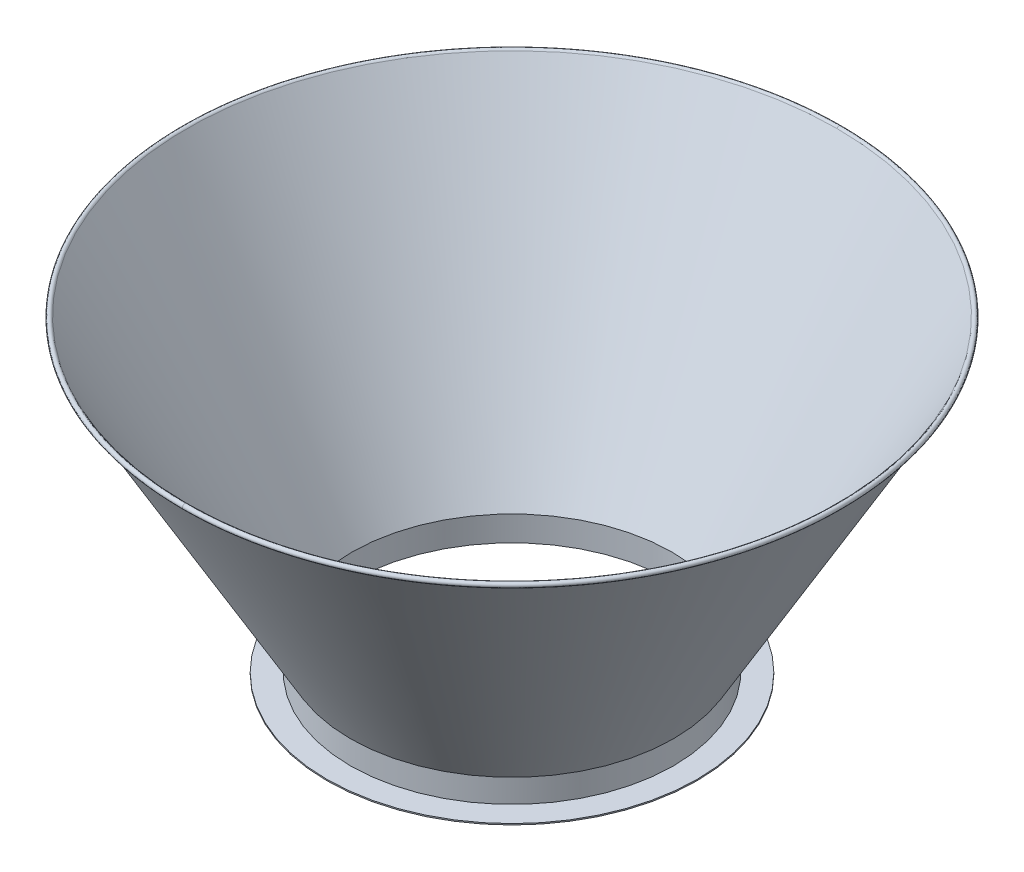
ISO-10303-21;
HEADER;
FILE_DESCRIPTION(('STEP AP214'),'2;1');
FILE_NAME('part.step','',(''),(''),'','','');
FILE_SCHEMA(('AUTOMOTIVE_DESIGN { 1 0 10303 214 1 1 1 1 }'));
ENDSEC;
DATA;
#1=APPLICATION_CONTEXT('core data for automotive mechanical design processes');
#2=APPLICATION_PROTOCOL_DEFINITION('international standard','automotive_design',2000,#1);
#3=PRODUCT_CONTEXT('',#1,'mechanical');
#4=PRODUCT('Part','Part','',(#3));
#5=PRODUCT_RELATED_PRODUCT_CATEGORY('part','',(#4));
#6=PRODUCT_DEFINITION_FORMATION('','',#4);
#7=PRODUCT_DEFINITION_CONTEXT('part definition',#1,'design');
#8=PRODUCT_DEFINITION('design','',#6,#7);
#9=PRODUCT_DEFINITION_SHAPE('','',#8);
#10=(LENGTH_UNIT() NAMED_UNIT(*) SI_UNIT(.MILLI.,.METRE.));
#11=(NAMED_UNIT(*) PLANE_ANGLE_UNIT() SI_UNIT($,.RADIAN.));
#12=(NAMED_UNIT(*) SI_UNIT($,.STERADIAN.) SOLID_ANGLE_UNIT());
#13=UNCERTAINTY_MEASURE_WITH_UNIT(LENGTH_MEASURE(1.E-05),#10,'distance_accuracy_value','');
#14=(GEOMETRIC_REPRESENTATION_CONTEXT(3) GLOBAL_UNCERTAINTY_ASSIGNED_CONTEXT((#13)) GLOBAL_UNIT_ASSIGNED_CONTEXT((#10,
#11,#12)) REPRESENTATION_CONTEXT('',''));
#15=CARTESIAN_POINT('',(0.,0.,0.));
#16=DIRECTION('',(0.,0.,1.));
#17=DIRECTION('',(1.,0.,0.));
#18=AXIS2_PLACEMENT_3D('',#15,#16,#17);
#19=CARTESIAN_POINT('',(0.,248.267949192,0.));
#20=DIRECTION('',(0.,1.,0.));
#21=DIRECTION('',(0.,0.,1.));
#22=AXIS2_PLACEMENT_3D('',#19,#20,#21);
#23=CONICAL_SURFACE('',#22,263.945262452,0.52359877549055);
#24=CARTESIAN_POINT('',(0.,249.133974596504,0.));
#25=DIRECTION('',(0.,1.,0.));
#26=DIRECTION('',(-1.,0.,0.));
#27=AXIS2_PLACEMENT_3D('',#24,#25,#26);
#28=CIRCLE('',#27,264.445262450613);
#29=CARTESIAN_POINT('',(-1.78091247272497E-08,249.133974596378,264.445262450959));
#30=VERTEX_POINT('',#29);
#31=CARTESIAN_POINT('',(-5.42386299834706E-08,249.133974596378,-264.445262450959));
#32=VERTEX_POINT('',#31);
#33=EDGE_CURVE('E56',#30,#32,#28,.T.);
#34=ORIENTED_EDGE('',*,*,#33,.T.);
#35=CARTESIAN_POINT('',(0.,249.133974596504,0.));
#36=DIRECTION('',(0.,1.,0.));
#37=DIRECTION('',(-1.,0.,0.));
#38=AXIS2_PLACEMENT_3D('',#35,#36,#37);
#39=CIRCLE('',#38,264.445262450613);
#40=EDGE_CURVE('E68',#32,#30,#39,.T.);
#41=ORIENTED_EDGE('',*,*,#40,.T.);
#42=EDGE_LOOP('',(#34,#41));
#43=FACE_BOUND('',#42,.T.);
#44=CARTESIAN_POINT('',(0.,248.267949193926,0.));
#45=DIRECTION('',(0.,1.,0.));
#46=DIRECTION('',(-1.,0.,0.));
#47=AXIS2_PLACEMENT_3D('',#44,#45,#46);
#48=CIRCLE('',#47,263.945262450143);
#49=CARTESIAN_POINT('',(-2.70680391346799E-08,248.267949193604,-263.945262450699));
#50=VERTEX_POINT('',#49);
#51=CARTESIAN_POINT('',(-1.18503014110697E-08,248.267949193444,263.945262450607));
#52=VERTEX_POINT('',#51);
#53=EDGE_CURVE('E70',#50,#52,#48,.T.);
#54=ORIENTED_EDGE('',*,*,#53,.F.);
#55=CARTESIAN_POINT('',(0.,248.267949193926,0.));
#56=DIRECTION('',(0.,1.,0.));
#57=DIRECTION('',(-1.,0.,0.));
#58=AXIS2_PLACEMENT_3D('',#55,#56,#57);
#59=CIRCLE('',#58,263.945262450143);
#60=EDGE_CURVE('E59',#52,#50,#59,.T.);
#61=ORIENTED_EDGE('',*,*,#60,.F.);
#62=EDGE_LOOP('',(#54,#61));
#63=FACE_BOUND('',#62,.T.);
#64=ADVANCED_FACE('F17',(#43,#63),#23,.F.);
#65=CARTESIAN_POINT('',(0.,250.411043808,264.03364686));
#66=CARTESIAN_POINT('',(528.067293719,250.411043808,264.03364686));
#67=CARTESIAN_POINT('',(528.067293719,250.411043808,-264.03364686));
#68=CARTESIAN_POINT('',(0.,250.411043808,-264.03364686));
#69=CARTESIAN_POINT('',(0.,251.438047279,264.496718598));
#70=CARTESIAN_POINT('',(528.993437196,251.438047279,264.496718598));
#71=CARTESIAN_POINT('',(528.993437196,251.438047279,-264.496718598));
#72=CARTESIAN_POINT('',(0.,251.438047279,-264.496718598));
#73=CARTESIAN_POINT('',(0.,251.347007076,265.619609174));
#74=CARTESIAN_POINT('',(531.239218348,251.347007076,265.619609174));
#75=CARTESIAN_POINT('',(531.239218348,251.347007076,-265.619609174));
#76=CARTESIAN_POINT('',(0.,251.347007076,-265.619609174));
#77=CARTESIAN_POINT('',(0.,250.258819045,265.911188278));
#78=CARTESIAN_POINT('',(531.822376557,250.258819045,265.911188278));
#79=CARTESIAN_POINT('',(531.822376557,250.258819045,-265.911188278));
#80=CARTESIAN_POINT('',(0.,250.258819045,-265.911188278));
#81=CARTESIAN_POINT('',(0.,249.170631014,266.202767382));
#82=CARTESIAN_POINT('',(532.405534765,249.170631014,266.202767382));
#83=CARTESIAN_POINT('',(532.405534765,249.170631014,-266.202767382));
#84=CARTESIAN_POINT('',(0.,249.170631014,-266.202767382));
#85=CARTESIAN_POINT('',(0.,248.530342598,265.275835719));
#86=CARTESIAN_POINT('',(530.551671438,248.530342598,265.275835719));
#87=CARTESIAN_POINT('',(530.551671438,248.530342598,-265.275835719));
#88=CARTESIAN_POINT('',(0.,248.530342598,-265.275835719));
#89=CARTESIAN_POINT('',(0.,249.188217824,264.361302094));
#90=CARTESIAN_POINT('',(528.722604189,249.188217824,264.361302094));
#91=CARTESIAN_POINT('',(528.722604189,249.188217824,-264.361302094));
#92=CARTESIAN_POINT('',(0.,249.188217824,-264.361302094));
#93=(BOUNDED_SURFACE() B_SPLINE_SURFACE(3,3,((#65,#66,#67,#68),(#69,#70,#71,#72),(#73,#74,#75,
#76),(#77,#78,#79,#80),(#81,#82,#83,#84),(#85,#86,#87,#88),(#89,#90,#91,#92)),.UNSPECIFIED.,.F.,
.F.,.F.) B_SPLINE_SURFACE_WITH_KNOTS((4,3,4),(4,4),(0.,0.5,1.),(0.,1.),
.UNSPECIFIED.) GEOMETRIC_REPRESENTATION_ITEM() RATIONAL_B_SPLINE_SURFACE(((1.,0.333333333333333,
0.333333333333333,1.),(0.557353630788248,0.185784543596083,0.185784543596083,0.557353630788248),
(0.557353630788248,0.185784543596083,0.185784543596083,0.557353630788248),(1.,0.333333333333333,
0.333333333333333,1.),(0.557353630788248,0.185784543596083,0.185784543596083,0.557353630788248),
(0.557353630788248,0.185784543596083,0.185784543596083,0.557353630788248),(1.,0.333333333333333,
0.333333333333333,1.))) REPRESENTATION_ITEM('') SURFACE());
#94=CARTESIAN_POINT('',(0.,250.411043808,264.03364686));
#95=CARTESIAN_POINT('',(0.,251.438047279,264.496718598));
#96=CARTESIAN_POINT('',(0.,251.347007076,265.619609174));
#97=CARTESIAN_POINT('',(0.,250.258819045,265.911188278));
#98=CARTESIAN_POINT('',(0.,249.170631014,266.202767382));
#99=CARTESIAN_POINT('',(0.,248.530342598,265.275835719));
#100=CARTESIAN_POINT('',(0.,249.188217824,264.361302094));
#101=(BOUNDED_CURVE() B_SPLINE_CURVE(3,(#94,#95,#96,#97,#98,#99,#100),.UNSPECIFIED.,.F.,
.F.) B_SPLINE_CURVE_WITH_KNOTS((4,3,4),(0.,0.5,1.),
.UNSPECIFIED.) CURVE() GEOMETRIC_REPRESENTATION_ITEM() RATIONAL_B_SPLINE_CURVE((1.,
0.557353630788248,0.557353630788248,1.,0.557353630788248,0.557353630788248,1.)) REPRESENTATION_ITEM(''));
#102=CARTESIAN_POINT('',(-2.37126328872314E-08,250.49999999983,264.079237047979));
#103=VERTEX_POINT('',#102);
#104=EDGE_CURVE('E108',#30,#103,#101,.F.);
#105=CARTESIAN_POINT('',(0.,250.5,0.));
#106=DIRECTION('',(0.,1.,0.));
#107=DIRECTION('',(0.,0.,1.));
#108=AXIS2_PLACEMENT_3D('',#105,#106,#107);
#109=CIRCLE('',#108,264.079237048);
#110=CARTESIAN_POINT('',(-8.12453353773865E-08,250.49999999983,-264.079237047979));
#111=VERTEX_POINT('',#110);
#112=EDGE_CURVE('E91',#103,#111,#109,.T.);
#113=CARTESIAN_POINT('',(0.,250.411043808,-264.03364686));
#114=CARTESIAN_POINT('',(0.,251.438047279,-264.496718598));
#115=CARTESIAN_POINT('',(0.,251.347007076,-265.619609174));
#116=CARTESIAN_POINT('',(0.,250.258819045,-265.911188278));
#117=CARTESIAN_POINT('',(0.,249.170631014,-266.202767382));
#118=CARTESIAN_POINT('',(0.,248.530342598,-265.275835719));
#119=CARTESIAN_POINT('',(0.,249.188217824,-264.361302094));
#120=(BOUNDED_CURVE() B_SPLINE_CURVE(3,(#113,#114,#115,#116,#117,#118,#119),.UNSPECIFIED.,.F.,
.F.) B_SPLINE_CURVE_WITH_KNOTS((4,3,4),(0.,0.5,1.),
.UNSPECIFIED.) CURVE() GEOMETRIC_REPRESENTATION_ITEM() RATIONAL_B_SPLINE_CURVE((1.,
0.557353630788248,0.557353630788248,1.,0.557353630788248,0.557353630788248,1.)) REPRESENTATION_ITEM(''));
#121=EDGE_CURVE('E105',#111,#32,#120,.T.);
#122=ORIENTED_EDGE('',*,*,#33,.F.);
#123=ORIENTED_EDGE('',*,*,#104,.T.);
#124=ORIENTED_EDGE('',*,*,#112,.T.);
#125=ORIENTED_EDGE('',*,*,#121,.T.);
#126=EDGE_LOOP('',(#122,#123,#124,#125));
#127=FACE_BOUND('',#126,.T.);
#128=ADVANCED_FACE('F206',(#127),#93,.F.);
#129=CARTESIAN_POINT('',(0.,250.411043808,-264.03364686));
#130=CARTESIAN_POINT('',(-528.067293719,250.411043808,-264.03364686));
#131=CARTESIAN_POINT('',(-528.067293719,250.411043808,264.03364686));
#132=CARTESIAN_POINT('',(0.,250.411043808,264.03364686));
#133=CARTESIAN_POINT('',(0.,251.438047279,-264.496718598));
#134=CARTESIAN_POINT('',(-528.993437196,251.438047279,-264.496718598));
#135=CARTESIAN_POINT('',(-528.993437196,251.438047279,264.496718598));
#136=CARTESIAN_POINT('',(0.,251.438047279,264.496718598));
#137=CARTESIAN_POINT('',(0.,251.347007076,-265.619609174));
#138=CARTESIAN_POINT('',(-531.239218348,251.347007076,-265.619609174));
#139=CARTESIAN_POINT('',(-531.239218348,251.347007076,265.619609174));
#140=CARTESIAN_POINT('',(0.,251.347007076,265.619609174));
#141=CARTESIAN_POINT('',(0.,250.258819045,-265.911188278));
#142=CARTESIAN_POINT('',(-531.822376557,250.258819045,-265.911188278));
#143=CARTESIAN_POINT('',(-531.822376557,250.258819045,265.911188278));
#144=CARTESIAN_POINT('',(0.,250.258819045,265.911188278));
#145=CARTESIAN_POINT('',(0.,249.170631014,-266.202767382));
#146=CARTESIAN_POINT('',(-532.405534765,249.170631014,-266.202767382));
#147=CARTESIAN_POINT('',(-532.405534765,249.170631014,266.202767382));
#148=CARTESIAN_POINT('',(0.,249.170631014,266.202767382));
#149=CARTESIAN_POINT('',(0.,248.530342598,-265.275835719));
#150=CARTESIAN_POINT('',(-530.551671438,248.530342598,-265.275835719));
#151=CARTESIAN_POINT('',(-530.551671438,248.530342598,265.275835719));
#152=CARTESIAN_POINT('',(0.,248.530342598,265.275835719));
#153=CARTESIAN_POINT('',(0.,249.188217824,-264.361302094));
#154=CARTESIAN_POINT('',(-528.722604189,249.188217824,-264.361302094));
#155=CARTESIAN_POINT('',(-528.722604189,249.188217824,264.361302094));
#156=CARTESIAN_POINT('',(0.,249.188217824,264.361302094));
#157=(BOUNDED_SURFACE() B_SPLINE_SURFACE(3,3,((#129,#130,#131,#132),(#133,#134,#135,#136),(#137,
#138,#139,#140),(#141,#142,#143,#144),(#145,#146,#147,#148),(#149,#150,#151,#152),(#153,#154,
#155,#156)),.UNSPECIFIED.,.F.,.F.,.F.) B_SPLINE_SURFACE_WITH_KNOTS((4,3,4),(4,4),(0.,0.5,1.),
(0.,1.),.UNSPECIFIED.) GEOMETRIC_REPRESENTATION_ITEM() RATIONAL_B_SPLINE_SURFACE(((1.,
0.333333333333333,0.333333333333333,1.),(0.557353630788248,0.185784543596083,0.185784543596083,
0.557353630788248),(0.557353630788248,0.185784543596083,0.185784543596083,0.557353630788248),
(1.,0.333333333333333,0.333333333333333,1.),(0.557353630788248,0.185784543596083,
0.185784543596083,0.557353630788248),(0.557353630788248,0.185784543596083,0.185784543596083,
0.557353630788248),(1.,0.333333333333333,0.333333333333333,1.))) REPRESENTATION_ITEM('') SURFACE());
#158=CARTESIAN_POINT('',(0.,250.5,0.));
#159=DIRECTION('',(0.,1.,0.));
#160=DIRECTION('',(0.,0.,1.));
#161=AXIS2_PLACEMENT_3D('',#158,#159,#160);
#162=CIRCLE('',#161,264.079237048);
#163=EDGE_CURVE('E97',#111,#103,#162,.T.);
#164=ORIENTED_EDGE('',*,*,#121,.F.);
#165=ORIENTED_EDGE('',*,*,#163,.T.);
#166=ORIENTED_EDGE('',*,*,#104,.F.);
#167=ORIENTED_EDGE('',*,*,#40,.F.);
#168=EDGE_LOOP('',(#164,#165,#166,#167));
#169=FACE_BOUND('',#168,.T.);
#170=ADVANCED_FACE('F211',(#169),#157,.F.);
#171=CARTESIAN_POINT('',(0.,250.822087615,263.122031267));
#172=CARTESIAN_POINT('',(526.244062535,250.822087615,263.122031267));
#173=CARTESIAN_POINT('',(526.244062535,250.822087615,-263.122031267));
#174=CARTESIAN_POINT('',(0.,250.822087615,-263.122031267));
#175=CARTESIAN_POINT('',(0.,252.876094557,264.048174744));
#176=CARTESIAN_POINT('',(528.096349489,252.876094557,264.048174744));
#177=CARTESIAN_POINT('',(528.096349489,252.876094557,-264.048174744));
#178=CARTESIAN_POINT('',(0.,252.876094557,-264.048174744));
#179=CARTESIAN_POINT('',(0.,252.694014152,266.293955896));
#180=CARTESIAN_POINT('',(532.587911793,252.694014152,266.293955896));
#181=CARTESIAN_POINT('',(532.587911793,252.694014152,-266.293955896));
#182=CARTESIAN_POINT('',(0.,252.694014152,-266.293955896));
#183=CARTESIAN_POINT('',(0.,250.51763809,266.877114105));
#184=CARTESIAN_POINT('',(533.754228209,250.51763809,266.877114105));
#185=CARTESIAN_POINT('',(533.754228209,250.51763809,-266.877114105));
#186=CARTESIAN_POINT('',(0.,250.51763809,-266.877114105));
#187=CARTESIAN_POINT('',(0.,248.341262029,267.460272313));
#188=CARTESIAN_POINT('',(534.920544625,248.341262029,267.460272313));
#189=CARTESIAN_POINT('',(534.920544625,248.341262029,-267.460272313));
#190=CARTESIAN_POINT('',(0.,248.341262029,-267.460272313));
#191=CARTESIAN_POINT('',(0.,247.060685196,265.606408986));
#192=CARTESIAN_POINT('',(531.212817973,247.060685196,265.606408986));
#193=CARTESIAN_POINT('',(531.212817973,247.060685196,-265.606408986));
#194=CARTESIAN_POINT('',(0.,247.060685196,-265.606408986));
#195=CARTESIAN_POINT('',(0.,248.376435649,263.777341737));
#196=CARTESIAN_POINT('',(527.554683474,248.376435649,263.777341737));
#197=CARTESIAN_POINT('',(527.554683474,248.376435649,-263.777341737));
#198=CARTESIAN_POINT('',(0.,248.376435649,-263.777341737));
#199=(BOUNDED_SURFACE() B_SPLINE_SURFACE(3,3,((#171,#172,#173,#174),(#175,#176,#177,#178),(#179,
#180,#181,#182),(#183,#184,#185,#186),(#187,#188,#189,#190),(#191,#192,#193,#194),(#195,#196,
#197,#198)),.UNSPECIFIED.,.F.,.F.,.F.) B_SPLINE_SURFACE_WITH_KNOTS((4,3,4),(4,4),(0.,0.5,1.),
(0.,1.),.UNSPECIFIED.) GEOMETRIC_REPRESENTATION_ITEM() RATIONAL_B_SPLINE_SURFACE(((1.,
0.333333333333333,0.333333333333333,1.),(0.557353630788253,0.185784543596084,0.185784543596084,
0.557353630788253),(0.557353630788253,0.185784543596084,0.185784543596084,0.557353630788253),
(1.,0.333333333333333,0.333333333333333,1.),(0.557353630788253,0.185784543596084,
0.185784543596084,0.557353630788253),(0.557353630788253,0.185784543596084,0.185784543596084,
0.557353630788253),(1.,0.333333333333333,0.333333333333333,1.))) REPRESENTATION_ITEM('') SURFACE());
#200=CARTESIAN_POINT('',(0.,251.,0.));
#201=DIRECTION('',(0.,1.,0.));
#202=DIRECTION('',(0.,0.,1.));
#203=AXIS2_PLACEMENT_3D('',#200,#201,#202);
#204=CIRCLE('',#203,263.213211644);
#205=CARTESIAN_POINT('',(-3.54523039858422E-08,250.999999999412,263.213211643729));
#206=VERTEX_POINT('',#205);
#207=CARTESIAN_POINT('',(-8.09788982080738E-08,250.99999999997,-263.213211644052));
#208=VERTEX_POINT('',#207);
#209=EDGE_CURVE('E37',#206,#208,#204,.T.);
#210=CARTESIAN_POINT('',(0.,250.822087615,263.122031267));
#211=CARTESIAN_POINT('',(0.,252.876094557,264.048174744));
#212=CARTESIAN_POINT('',(0.,252.694014152,266.293955896));
#213=CARTESIAN_POINT('',(0.,250.51763809,266.877114105));
#214=CARTESIAN_POINT('',(0.,248.341262029,267.460272313));
#215=CARTESIAN_POINT('',(0.,247.060685196,265.606408986));
#216=CARTESIAN_POINT('',(0.,248.376435649,263.777341737));
#217=(BOUNDED_CURVE() B_SPLINE_CURVE(3,(#210,#211,#212,#213,#214,#215,#216),.UNSPECIFIED.,.F.,
.F.) B_SPLINE_CURVE_WITH_KNOTS((4,3,4),(0.,0.5,1.),
.UNSPECIFIED.) CURVE() GEOMETRIC_REPRESENTATION_ITEM() RATIONAL_B_SPLINE_CURVE((1.,
0.557353630788253,0.557353630788253,1.,0.557353630788253,0.557353630788253,1.)) REPRESENTATION_ITEM(''));
#218=EDGE_CURVE('E64',#52,#206,#217,.F.);
#219=CARTESIAN_POINT('',(0.,250.822087615,-263.122031267));
#220=CARTESIAN_POINT('',(0.,252.876094557,-264.048174744));
#221=CARTESIAN_POINT('',(0.,252.694014152,-266.293955896));
#222=CARTESIAN_POINT('',(0.,250.51763809,-266.877114105));
#223=CARTESIAN_POINT('',(0.,248.341262029,-267.460272313));
#224=CARTESIAN_POINT('',(0.,247.060685196,-265.606408986));
#225=CARTESIAN_POINT('',(0.,248.376435649,-263.777341737));
#226=(BOUNDED_CURVE() B_SPLINE_CURVE(3,(#219,#220,#221,#222,#223,#224,#225),.UNSPECIFIED.,.F.,
.F.) B_SPLINE_CURVE_WITH_KNOTS((4,3,4),(0.,0.5,1.),
.UNSPECIFIED.) CURVE() GEOMETRIC_REPRESENTATION_ITEM() RATIONAL_B_SPLINE_CURVE((1.,
0.557353630788253,0.557353630788253,1.,0.557353630788253,0.557353630788253,1.)) REPRESENTATION_ITEM(''));
#227=EDGE_CURVE('E63',#208,#50,#226,.T.);
#228=ORIENTED_EDGE('',*,*,#209,.F.);
#229=ORIENTED_EDGE('',*,*,#218,.F.);
#230=ORIENTED_EDGE('',*,*,#60,.T.);
#231=ORIENTED_EDGE('',*,*,#227,.F.);
#232=EDGE_LOOP('',(#228,#229,#230,#231));
#233=FACE_BOUND('',#232,.T.);
#234=ADVANCED_FACE('F61',(#233),#199,.T.);
#235=CARTESIAN_POINT('',(0.,250.822087615,-263.122031267));
#236=CARTESIAN_POINT('',(-526.244062535,250.822087615,-263.122031267));
#237=CARTESIAN_POINT('',(-526.244062535,250.822087615,263.122031267));
#238=CARTESIAN_POINT('',(0.,250.822087615,263.122031267));
#239=CARTESIAN_POINT('',(0.,252.876094557,-264.048174744));
#240=CARTESIAN_POINT('',(-528.096349489,252.876094557,-264.048174744));
#241=CARTESIAN_POINT('',(-528.096349489,252.876094557,264.048174744));
#242=CARTESIAN_POINT('',(0.,252.876094557,264.048174744));
#243=CARTESIAN_POINT('',(0.,252.694014152,-266.293955896));
#244=CARTESIAN_POINT('',(-532.587911793,252.694014152,-266.293955896));
#245=CARTESIAN_POINT('',(-532.587911793,252.694014152,266.293955896));
#246=CARTESIAN_POINT('',(0.,252.694014152,266.293955896));
#247=CARTESIAN_POINT('',(0.,250.51763809,-266.877114105));
#248=CARTESIAN_POINT('',(-533.754228209,250.51763809,-266.877114105));
#249=CARTESIAN_POINT('',(-533.754228209,250.51763809,266.877114105));
#250=CARTESIAN_POINT('',(0.,250.51763809,266.877114105));
#251=CARTESIAN_POINT('',(0.,248.341262029,-267.460272313));
#252=CARTESIAN_POINT('',(-534.920544625,248.341262029,-267.460272313));
#253=CARTESIAN_POINT('',(-534.920544625,248.341262029,267.460272313));
#254=CARTESIAN_POINT('',(0.,248.341262029,267.460272313));
#255=CARTESIAN_POINT('',(0.,247.060685196,-265.606408986));
#256=CARTESIAN_POINT('',(-531.212817973,247.060685196,-265.606408986));
#257=CARTESIAN_POINT('',(-531.212817973,247.060685196,265.606408986));
#258=CARTESIAN_POINT('',(0.,247.060685196,265.606408986));
#259=CARTESIAN_POINT('',(0.,248.376435649,-263.777341737));
#260=CARTESIAN_POINT('',(-527.554683474,248.376435649,-263.777341737));
#261=CARTESIAN_POINT('',(-527.554683474,248.376435649,263.777341737));
#262=CARTESIAN_POINT('',(0.,248.376435649,263.777341737));
#263=(BOUNDED_SURFACE() B_SPLINE_SURFACE(3,3,((#235,#236,#237,#238),(#239,#240,#241,#242),(#243,
#244,#245,#246),(#247,#248,#249,#250),(#251,#252,#253,#254),(#255,#256,#257,#258),(#259,#260,
#261,#262)),.UNSPECIFIED.,.F.,.F.,.F.) B_SPLINE_SURFACE_WITH_KNOTS((4,3,4),(4,4),(0.,0.5,1.),
(0.,1.),.UNSPECIFIED.) GEOMETRIC_REPRESENTATION_ITEM() RATIONAL_B_SPLINE_SURFACE(((1.,
0.333333333333333,0.333333333333333,1.),(0.557353630788253,0.185784543596084,0.185784543596084,
0.557353630788253),(0.557353630788253,0.185784543596084,0.185784543596084,0.557353630788253),
(1.,0.333333333333333,0.333333333333333,1.),(0.557353630788253,0.185784543596084,
0.185784543596084,0.557353630788253),(0.557353630788253,0.185784543596084,0.185784543596084,
0.557353630788253),(1.,0.333333333333333,0.333333333333333,1.))) REPRESENTATION_ITEM('') SURFACE());
#264=CARTESIAN_POINT('',(0.,251.,0.));
#265=DIRECTION('',(0.,1.,0.));
#266=DIRECTION('',(0.,0.,1.));
#267=AXIS2_PLACEMENT_3D('',#264,#265,#266);
#268=CIRCLE('',#267,263.213211644);
#269=EDGE_CURVE('E77',#208,#206,#268,.T.);
#270=ORIENTED_EDGE('',*,*,#218,.T.);
#271=ORIENTED_EDGE('',*,*,#269,.F.);
#272=ORIENTED_EDGE('',*,*,#227,.T.);
#273=ORIENTED_EDGE('',*,*,#53,.T.);
#274=EDGE_LOOP('',(#270,#271,#272,#273));
#275=FACE_BOUND('',#274,.T.);
#276=ADVANCED_FACE('F75',(#275),#263,.T.);
#277=CARTESIAN_POINT('',(0.,20.,0.));
#278=DIRECTION('',(0.,1.,0.));
#279=DIRECTION('',(-1.,0.,0.));
#280=AXIS2_PLACEMENT_3D('',#277,#278,#279);
#281=CONICAL_SURFACE('',#280,131.,0.523598775597619);
#282=CARTESIAN_POINT('',(0.,20.,0.));
#283=DIRECTION('',(0.,1.,0.));
#284=DIRECTION('',(0.,0.,1.));
#285=AXIS2_PLACEMENT_3D('',#282,#283,#284);
#286=CIRCLE('',#285,131.);
#287=CARTESIAN_POINT('',(0.,20.,131.));
#288=VERTEX_POINT('',#287);
#289=EDGE_CURVE('E151',#288,#288,#286,.T.);
#290=ORIENTED_EDGE('',*,*,#289,.T.);
#291=EDGE_LOOP('',(#290));
#292=FACE_BOUND('',#291,.T.);
#293=ORIENTED_EDGE('',*,*,#112,.F.);
#294=ORIENTED_EDGE('',*,*,#163,.F.);
#295=EDGE_LOOP('',(#293,#294));
#296=FACE_BOUND('',#295,.T.);
#297=ADVANCED_FACE('F172',(#292,#296),#281,.T.);
#298=CARTESIAN_POINT('',(0.,20.267949192,0.));
#299=DIRECTION('',(0.,1.,0.));
#300=DIRECTION('',(0.,0.,1.));
#301=AXIS2_PLACEMENT_3D('',#298,#299,#300);
#302=CONICAL_SURFACE('',#301,130.,0.52359877559611);
#303=ORIENTED_EDGE('',*,*,#209,.T.);
#304=ORIENTED_EDGE('',*,*,#269,.T.);
#305=EDGE_LOOP('',(#303,#304));
#306=FACE_BOUND('',#305,.T.);
#307=CARTESIAN_POINT('',(0.,20.267949192,0.));
#308=DIRECTION('',(0.,1.,0.));
#309=DIRECTION('',(0.,0.,1.));
#310=AXIS2_PLACEMENT_3D('',#307,#308,#309);
#311=CIRCLE('',#310,130.);
#312=CARTESIAN_POINT('',(0.,20.267949192,130.));
#313=VERTEX_POINT('',#312);
#314=EDGE_CURVE('E146',#313,#313,#311,.T.);
#315=ORIENTED_EDGE('',*,*,#314,.F.);
#316=EDGE_LOOP('',(#315));
#317=FACE_BOUND('',#316,.T.);
#318=ADVANCED_FACE('F168',(#306,#317),#302,.F.);
#319=CARTESIAN_POINT('',(0.,1.,0.));
#320=DIRECTION('',(0.,1.,0.));
#321=DIRECTION('',(0.,0.,1.));
#322=AXIS2_PLACEMENT_3D('',#319,#320,#321);
#323=CYLINDRICAL_SURFACE('',#322,131.);
#324=CARTESIAN_POINT('',(0.,1.,0.));
#325=DIRECTION('',(0.,1.,0.));
#326=DIRECTION('',(0.,0.,1.));
#327=AXIS2_PLACEMENT_3D('',#324,#325,#326);
#328=CIRCLE('',#327,131.);
#329=CARTESIAN_POINT('',(0.,1.,131.));
#330=VERTEX_POINT('',#329);
#331=EDGE_CURVE('E21',#330,#330,#328,.F.);
#332=ORIENTED_EDGE('',*,*,#331,.F.);
#333=EDGE_LOOP('',(#332));
#334=FACE_BOUND('',#333,.T.);
#335=ORIENTED_EDGE('',*,*,#289,.F.);
#336=EDGE_LOOP('',(#335));
#337=FACE_BOUND('',#336,.T.);
#338=ADVANCED_FACE('F171',(#334,#337),#323,.T.);
#339=CARTESIAN_POINT('',(0.,0.,0.));
#340=DIRECTION('',(0.,1.,0.));
#341=DIRECTION('',(0.,0.,1.));
#342=AXIS2_PLACEMENT_3D('',#339,#340,#341);
#343=CYLINDRICAL_SURFACE('',#342,130.);
#344=ORIENTED_EDGE('',*,*,#314,.T.);
#345=EDGE_LOOP('',(#344));
#346=FACE_BOUND('',#345,.T.);
#347=CARTESIAN_POINT('',(0.,0.,0.));
#348=DIRECTION('',(0.,1.,0.));
#349=DIRECTION('',(0.,0.,1.));
#350=AXIS2_PLACEMENT_3D('',#347,#348,#349);
#351=CIRCLE('',#350,130.);
#352=CARTESIAN_POINT('',(0.,0.,130.));
#353=VERTEX_POINT('',#352);
#354=EDGE_CURVE('E139',#353,#353,#351,.T.);
#355=ORIENTED_EDGE('',*,*,#354,.F.);
#356=EDGE_LOOP('',(#355));
#357=FACE_BOUND('',#356,.T.);
#358=ADVANCED_FACE('F179',(#346,#357),#343,.F.);
#359=CARTESIAN_POINT('',(-151.8,1.,-151.8));
#360=DIRECTION('',(0.,1.,0.));
#361=DIRECTION('',(0.,0.,1.));
#362=AXIS2_PLACEMENT_3D('',#359,#360,#361);
#363=PLANE('',#362);
#364=ORIENTED_EDGE('',*,*,#331,.T.);
#365=EDGE_LOOP('',(#364));
#366=FACE_BOUND('',#365,.T.);
#367=CARTESIAN_POINT('',(0.,1.,0.));
#368=DIRECTION('',(0.,1.,0.));
#369=DIRECTION('',(0.,0.,1.));
#370=AXIS2_PLACEMENT_3D('',#367,#368,#369);
#371=CIRCLE('',#370,150.);
#372=CARTESIAN_POINT('',(0.,1.,150.));
#373=VERTEX_POINT('',#372);
#374=EDGE_CURVE('E28',#373,#373,#371,.T.);
#375=ORIENTED_EDGE('',*,*,#374,.T.);
#376=EDGE_LOOP('',(#375));
#377=FACE_BOUND('',#376,.T.);
#378=ADVANCED_FACE('F191',(#366,#377),#363,.T.);
#379=CARTESIAN_POINT('',(-151.8,0.,151.8));
#380=DIRECTION('',(0.,-1.,0.));
#381=DIRECTION('',(0.,0.,-1.));
#382=AXIS2_PLACEMENT_3D('',#379,#380,#381);
#383=PLANE('',#382);
#384=ORIENTED_EDGE('',*,*,#354,.T.);
#385=EDGE_LOOP('',(#384));
#386=FACE_BOUND('',#385,.T.);
#387=CARTESIAN_POINT('',(0.,0.,0.));
#388=DIRECTION('',(0.,1.,0.));
#389=DIRECTION('',(0.,0.,1.));
#390=AXIS2_PLACEMENT_3D('',#387,#388,#389);
#391=CIRCLE('',#390,150.);
#392=CARTESIAN_POINT('',(0.,0.,150.));
#393=VERTEX_POINT('',#392);
#394=EDGE_CURVE('E11',#393,#393,#391,.F.);
#395=ORIENTED_EDGE('',*,*,#394,.T.);
#396=EDGE_LOOP('',(#395));
#397=FACE_BOUND('',#396,.T.);
#398=ADVANCED_FACE('F19',(#386,#397),#383,.T.);
#399=CARTESIAN_POINT('',(0.,0.,0.));
#400=DIRECTION('',(0.,1.,0.));
#401=DIRECTION('',(0.,0.,1.));
#402=AXIS2_PLACEMENT_3D('',#399,#400,#401);
#403=CYLINDRICAL_SURFACE('',#402,150.);
#404=ORIENTED_EDGE('',*,*,#394,.F.);
#405=EDGE_LOOP('',(#404));
#406=FACE_BOUND('',#405,.T.);
#407=ORIENTED_EDGE('',*,*,#374,.F.);
#408=EDGE_LOOP('',(#407));
#409=FACE_BOUND('',#408,.T.);
#410=ADVANCED_FACE('F184',(#406,#409),#403,.T.);
#411=CLOSED_SHELL('',(#64,#128,#170,#234,#276,#297,#318,#338,#358,#378,#398,#410));
#412=MANIFOLD_SOLID_BREP('B1',#411);
#413=ADVANCED_BREP_SHAPE_REPRESENTATION('',(#18,#412),#14);
#414=SHAPE_DEFINITION_REPRESENTATION(#9,#413);
ENDSEC;
END-ISO-10303-21;
